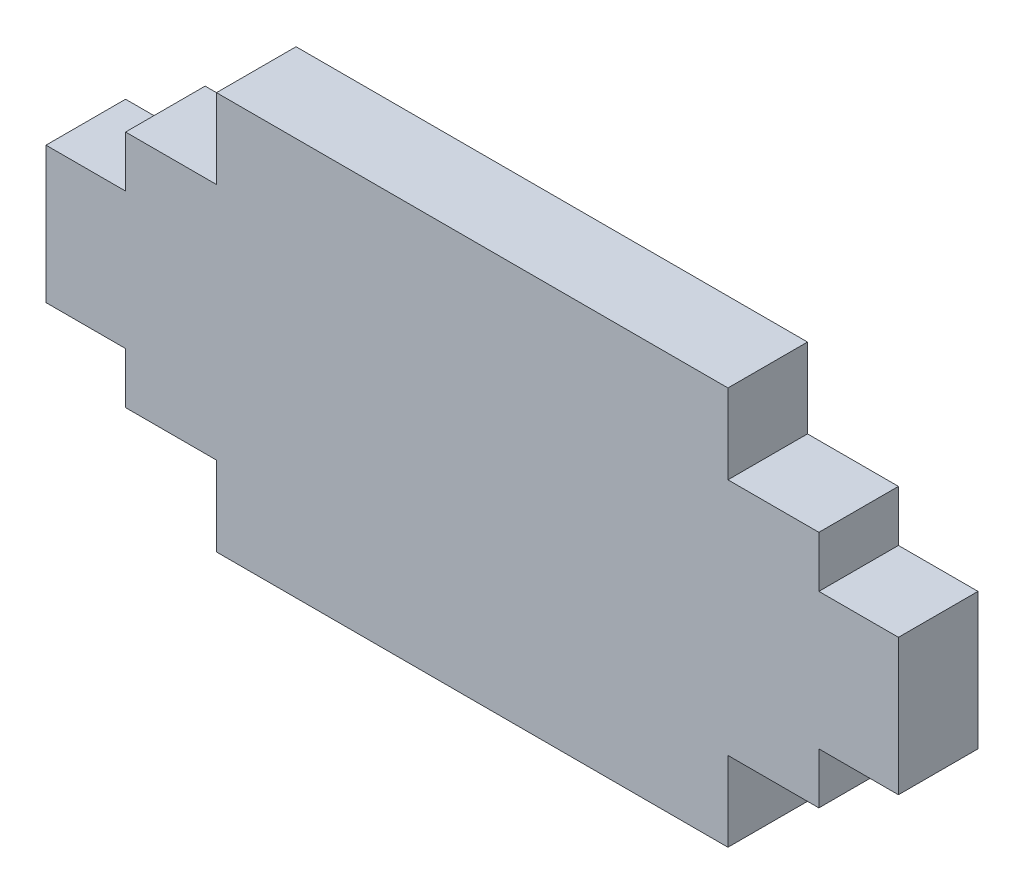
ISO-10303-21;
HEADER;
FILE_DESCRIPTION(('STEP AP214'),'2;1');
FILE_NAME('part.step','',(''),(''),'','','');
FILE_SCHEMA(('AUTOMOTIVE_DESIGN { 1 0 10303 214 1 1 1 1 }'));
ENDSEC;
DATA;
#1=APPLICATION_CONTEXT('core data for automotive mechanical design processes');
#2=APPLICATION_PROTOCOL_DEFINITION('international standard','automotive_design',2000,#1);
#3=PRODUCT_CONTEXT('',#1,'mechanical');
#4=PRODUCT('Part','Part','',(#3));
#5=PRODUCT_RELATED_PRODUCT_CATEGORY('part','',(#4));
#6=PRODUCT_DEFINITION_FORMATION('','',#4);
#7=PRODUCT_DEFINITION_CONTEXT('part definition',#1,'design');
#8=PRODUCT_DEFINITION('design','',#6,#7);
#9=PRODUCT_DEFINITION_SHAPE('','',#8);
#10=(LENGTH_UNIT() NAMED_UNIT(*) SI_UNIT(.MILLI.,.METRE.));
#11=(NAMED_UNIT(*) PLANE_ANGLE_UNIT() SI_UNIT($,.RADIAN.));
#12=(NAMED_UNIT(*) SI_UNIT($,.STERADIAN.) SOLID_ANGLE_UNIT());
#13=UNCERTAINTY_MEASURE_WITH_UNIT(LENGTH_MEASURE(1.E-05),#10,'distance_accuracy_value','');
#14=(GEOMETRIC_REPRESENTATION_CONTEXT(3) GLOBAL_UNCERTAINTY_ASSIGNED_CONTEXT((#13)) GLOBAL_UNIT_ASSIGNED_CONTEXT((#10,
#11,#12)) REPRESENTATION_CONTEXT('',''));
#15=CARTESIAN_POINT('',(0.,0.,0.));
#16=DIRECTION('',(0.,0.,1.));
#17=DIRECTION('',(1.,0.,0.));
#18=AXIS2_PLACEMENT_3D('',#15,#16,#17);
#19=CARTESIAN_POINT('',(0.,-3.,3.5));
#20=DIRECTION('',(1.,0.,0.));
#21=DIRECTION('',(0.,0.,-1.));
#22=AXIS2_PLACEMENT_3D('',#19,#20,#21);
#23=PLANE('',#22);
#24=DIRECTION('',(0.,-1.,0.));
#25=VECTOR('',#24,1.);
#26=CARTESIAN_POINT('',(0.,-3.,0.));
#27=LINE('',#26,#25);
#28=CARTESIAN_POINT('',(0.,-3.,0.));
#29=VERTEX_POINT('',#28);
#30=CARTESIAN_POINT('',(0.,-5.25,0.));
#31=VERTEX_POINT('',#30);
#32=EDGE_CURVE('E216',#29,#31,#27,.T.);
#33=ORIENTED_EDGE('',*,*,#32,.T.);
#34=DIRECTION('',(0.,0.,-1.));
#35=VECTOR('',#34,1.);
#36=CARTESIAN_POINT('',(0.,-5.25,3.5));
#37=LINE('',#36,#35);
#38=CARTESIAN_POINT('',(0.,-5.25,3.5));
#39=VERTEX_POINT('',#38);
#40=EDGE_CURVE('E11',#39,#31,#37,.T.);
#41=ORIENTED_EDGE('',*,*,#40,.F.);
#42=DIRECTION('',(0.,-1.,0.));
#43=VECTOR('',#42,1.);
#44=CARTESIAN_POINT('',(0.,-3.,3.5));
#45=LINE('',#44,#43);
#46=CARTESIAN_POINT('',(0.,-3.,3.5));
#47=VERTEX_POINT('',#46);
#48=EDGE_CURVE('E254',#47,#39,#45,.T.);
#49=ORIENTED_EDGE('',*,*,#48,.F.);
#50=DIRECTION('',(0.,0.,-1.));
#51=VECTOR('',#50,1.);
#52=CARTESIAN_POINT('',(0.,-3.,3.5));
#53=LINE('',#52,#51);
#54=EDGE_CURVE('E212',#47,#29,#53,.T.);
#55=ORIENTED_EDGE('',*,*,#54,.T.);
#56=EDGE_LOOP('',(#33,#41,#49,#55));
#57=FACE_BOUND('',#56,.T.);
#58=ADVANCED_FACE('F47',(#57),#23,.F.);
#59=CARTESIAN_POINT('',(0.,-5.25,3.5));
#60=DIRECTION('',(0.,1.,0.));
#61=DIRECTION('',(0.,0.,1.));
#62=AXIS2_PLACEMENT_3D('',#59,#60,#61);
#63=PLANE('',#62);
#64=DIRECTION('',(1.,0.,0.));
#65=VECTOR('',#64,1.);
#66=CARTESIAN_POINT('',(0.,-5.25,0.));
#67=LINE('',#66,#65);
#68=CARTESIAN_POINT('',(4.,-5.25,0.));
#69=VERTEX_POINT('',#68);
#70=EDGE_CURVE('E219',#31,#69,#67,.T.);
#71=ORIENTED_EDGE('',*,*,#70,.T.);
#72=DIRECTION('',(0.,0.,-1.));
#73=VECTOR('',#72,1.);
#74=CARTESIAN_POINT('',(4.,-5.25,3.5));
#75=LINE('',#74,#73);
#76=CARTESIAN_POINT('',(4.,-5.25,3.5));
#77=VERTEX_POINT('',#76);
#78=EDGE_CURVE('E56',#77,#69,#75,.T.);
#79=ORIENTED_EDGE('',*,*,#78,.F.);
#80=DIRECTION('',(1.,0.,0.));
#81=VECTOR('',#80,1.);
#82=CARTESIAN_POINT('',(0.,-5.25,3.5));
#83=LINE('',#82,#81);
#84=EDGE_CURVE('E143',#39,#77,#83,.T.);
#85=ORIENTED_EDGE('',*,*,#84,.F.);
#86=ORIENTED_EDGE('',*,*,#40,.T.);
#87=EDGE_LOOP('',(#71,#79,#85,#86));
#88=FACE_BOUND('',#87,.T.);
#89=ADVANCED_FACE('F372',(#88),#63,.F.);
#90=CARTESIAN_POINT('',(4.,-5.25,3.5));
#91=DIRECTION('',(1.,0.,0.));
#92=DIRECTION('',(0.,0.,-1.));
#93=AXIS2_PLACEMENT_3D('',#90,#91,#92);
#94=PLANE('',#93);
#95=DIRECTION('',(0.,-1.,0.));
#96=VECTOR('',#95,1.);
#97=CARTESIAN_POINT('',(4.,-5.25,0.));
#98=LINE('',#97,#96);
#99=CARTESIAN_POINT('',(4.,-8.75,0.));
#100=VERTEX_POINT('',#99);
#101=EDGE_CURVE('E221',#69,#100,#98,.T.);
#102=ORIENTED_EDGE('',*,*,#101,.T.);
#103=DIRECTION('',(0.,0.,-1.));
#104=VECTOR('',#103,1.);
#105=CARTESIAN_POINT('',(4.,-8.75,3.5));
#106=LINE('',#105,#104);
#107=CARTESIAN_POINT('',(4.,-8.75,3.5));
#108=VERTEX_POINT('',#107);
#109=EDGE_CURVE('E297',#108,#100,#106,.T.);
#110=ORIENTED_EDGE('',*,*,#109,.F.);
#111=DIRECTION('',(0.,-1.,0.));
#112=VECTOR('',#111,1.);
#113=CARTESIAN_POINT('',(4.,-5.25,3.5));
#114=LINE('',#113,#112);
#115=EDGE_CURVE('E305',#77,#108,#114,.T.);
#116=ORIENTED_EDGE('',*,*,#115,.F.);
#117=ORIENTED_EDGE('',*,*,#78,.T.);
#118=EDGE_LOOP('',(#102,#110,#116,#117));
#119=FACE_BOUND('',#118,.T.);
#120=ADVANCED_FACE('F303',(#119),#94,.F.);
#121=CARTESIAN_POINT('',(4.,-8.75,3.5));
#122=DIRECTION('',(0.,1.,0.));
#123=DIRECTION('',(0.,0.,1.));
#124=AXIS2_PLACEMENT_3D('',#121,#122,#123);
#125=PLANE('',#124);
#126=DIRECTION('',(1.,0.,0.));
#127=VECTOR('',#126,1.);
#128=CARTESIAN_POINT('',(4.,-8.75,0.));
#129=LINE('',#128,#127);
#130=CARTESIAN_POINT('',(26.5,-8.75,0.));
#131=VERTEX_POINT('',#130);
#132=EDGE_CURVE('E223',#100,#131,#129,.T.);
#133=ORIENTED_EDGE('',*,*,#132,.T.);
#134=DIRECTION('',(0.,0.,-1.));
#135=VECTOR('',#134,1.);
#136=CARTESIAN_POINT('',(26.5,-8.75,3.5));
#137=LINE('',#136,#135);
#138=CARTESIAN_POINT('',(26.5,-8.75,3.5));
#139=VERTEX_POINT('',#138);
#140=EDGE_CURVE('E294',#139,#131,#137,.T.);
#141=ORIENTED_EDGE('',*,*,#140,.F.);
#142=DIRECTION('',(1.,0.,0.));
#143=VECTOR('',#142,1.);
#144=CARTESIAN_POINT('',(4.,-8.75,3.5));
#145=LINE('',#144,#143);
#146=EDGE_CURVE('E323',#108,#139,#145,.T.);
#147=ORIENTED_EDGE('',*,*,#146,.F.);
#148=ORIENTED_EDGE('',*,*,#109,.T.);
#149=EDGE_LOOP('',(#133,#141,#147,#148));
#150=FACE_BOUND('',#149,.T.);
#151=ADVANCED_FACE('F314',(#150),#125,.F.);
#152=CARTESIAN_POINT('',(26.5,-8.75,3.5));
#153=DIRECTION('',(-1.,0.,0.));
#154=DIRECTION('',(0.,0.,1.));
#155=AXIS2_PLACEMENT_3D('',#152,#153,#154);
#156=PLANE('',#155);
#157=DIRECTION('',(0.,1.,0.));
#158=VECTOR('',#157,1.);
#159=CARTESIAN_POINT('',(26.5,-8.75,0.));
#160=LINE('',#159,#158);
#161=CARTESIAN_POINT('',(26.5,-5.25,0.));
#162=VERTEX_POINT('',#161);
#163=EDGE_CURVE('E225',#131,#162,#160,.T.);
#164=ORIENTED_EDGE('',*,*,#163,.T.);
#165=DIRECTION('',(0.,0.,-1.));
#166=VECTOR('',#165,1.);
#167=CARTESIAN_POINT('',(26.5,-5.25,3.5));
#168=LINE('',#167,#166);
#169=CARTESIAN_POINT('',(26.5,-5.25,3.5));
#170=VERTEX_POINT('',#169);
#171=EDGE_CURVE('E291',#170,#162,#168,.T.);
#172=ORIENTED_EDGE('',*,*,#171,.F.);
#173=DIRECTION('',(0.,1.,0.));
#174=VECTOR('',#173,1.);
#175=CARTESIAN_POINT('',(26.5,-8.75,3.5));
#176=LINE('',#175,#174);
#177=EDGE_CURVE('E320',#139,#170,#176,.T.);
#178=ORIENTED_EDGE('',*,*,#177,.F.);
#179=ORIENTED_EDGE('',*,*,#140,.T.);
#180=EDGE_LOOP('',(#164,#172,#178,#179));
#181=FACE_BOUND('',#180,.T.);
#182=ADVANCED_FACE('F318',(#181),#156,.F.);
#183=CARTESIAN_POINT('',(26.5,-5.25,3.5));
#184=DIRECTION('',(0.,1.,0.));
#185=DIRECTION('',(0.,0.,1.));
#186=AXIS2_PLACEMENT_3D('',#183,#184,#185);
#187=PLANE('',#186);
#188=DIRECTION('',(1.,0.,0.));
#189=VECTOR('',#188,1.);
#190=CARTESIAN_POINT('',(26.5,-5.25,0.));
#191=LINE('',#190,#189);
#192=CARTESIAN_POINT('',(30.5,-5.25,0.));
#193=VERTEX_POINT('',#192);
#194=EDGE_CURVE('E227',#162,#193,#191,.T.);
#195=ORIENTED_EDGE('',*,*,#194,.T.);
#196=DIRECTION('',(0.,0.,-1.));
#197=VECTOR('',#196,1.);
#198=CARTESIAN_POINT('',(30.5,-5.25,3.5));
#199=LINE('',#198,#197);
#200=CARTESIAN_POINT('',(30.5,-5.25,3.5));
#201=VERTEX_POINT('',#200);
#202=EDGE_CURVE('E288',#201,#193,#199,.T.);
#203=ORIENTED_EDGE('',*,*,#202,.F.);
#204=DIRECTION('',(1.,0.,0.));
#205=VECTOR('',#204,1.);
#206=CARTESIAN_POINT('',(26.5,-5.25,3.5));
#207=LINE('',#206,#205);
#208=EDGE_CURVE('E322',#170,#201,#207,.T.);
#209=ORIENTED_EDGE('',*,*,#208,.F.);
#210=ORIENTED_EDGE('',*,*,#171,.T.);
#211=EDGE_LOOP('',(#195,#203,#209,#210));
#212=FACE_BOUND('',#211,.T.);
#213=ADVANCED_FACE('F388',(#212),#187,.F.);
#214=CARTESIAN_POINT('',(30.5,-5.25,3.5));
#215=DIRECTION('',(-1.,0.,0.));
#216=DIRECTION('',(0.,0.,1.));
#217=AXIS2_PLACEMENT_3D('',#214,#215,#216);
#218=PLANE('',#217);
#219=DIRECTION('',(0.,1.,0.));
#220=VECTOR('',#219,1.);
#221=CARTESIAN_POINT('',(30.5,-5.25,0.));
#222=LINE('',#221,#220);
#223=CARTESIAN_POINT('',(30.5,-3.,0.));
#224=VERTEX_POINT('',#223);
#225=EDGE_CURVE('E229',#193,#224,#222,.T.);
#226=ORIENTED_EDGE('',*,*,#225,.T.);
#227=DIRECTION('',(0.,0.,-1.));
#228=VECTOR('',#227,1.);
#229=CARTESIAN_POINT('',(30.5,-3.,3.5));
#230=LINE('',#229,#228);
#231=CARTESIAN_POINT('',(30.5,-3.,3.5));
#232=VERTEX_POINT('',#231);
#233=EDGE_CURVE('E285',#232,#224,#230,.T.);
#234=ORIENTED_EDGE('',*,*,#233,.F.);
#235=DIRECTION('',(0.,1.,0.));
#236=VECTOR('',#235,1.);
#237=CARTESIAN_POINT('',(30.5,-5.25,3.5));
#238=LINE('',#237,#236);
#239=EDGE_CURVE('E325',#201,#232,#238,.T.);
#240=ORIENTED_EDGE('',*,*,#239,.F.);
#241=ORIENTED_EDGE('',*,*,#202,.T.);
#242=EDGE_LOOP('',(#226,#234,#240,#241));
#243=FACE_BOUND('',#242,.T.);
#244=ADVANCED_FACE('F392',(#243),#218,.F.);
#245=CARTESIAN_POINT('',(30.5,-3.,3.5));
#246=DIRECTION('',(0.,1.,0.));
#247=DIRECTION('',(0.,0.,1.));
#248=AXIS2_PLACEMENT_3D('',#245,#246,#247);
#249=PLANE('',#248);
#250=DIRECTION('',(1.,0.,0.));
#251=VECTOR('',#250,1.);
#252=CARTESIAN_POINT('',(30.5,-3.,0.));
#253=LINE('',#252,#251);
#254=CARTESIAN_POINT('',(34.,-3.,0.));
#255=VERTEX_POINT('',#254);
#256=EDGE_CURVE('E231',#224,#255,#253,.T.);
#257=ORIENTED_EDGE('',*,*,#256,.T.);
#258=DIRECTION('',(0.,0.,-1.));
#259=VECTOR('',#258,1.);
#260=CARTESIAN_POINT('',(34.,-3.,3.5));
#261=LINE('',#260,#259);
#262=CARTESIAN_POINT('',(34.,-3.,3.5));
#263=VERTEX_POINT('',#262);
#264=EDGE_CURVE('E282',#263,#255,#261,.T.);
#265=ORIENTED_EDGE('',*,*,#264,.F.);
#266=DIRECTION('',(1.,0.,0.));
#267=VECTOR('',#266,1.);
#268=CARTESIAN_POINT('',(30.5,-3.,3.5));
#269=LINE('',#268,#267);
#270=EDGE_CURVE('E331',#232,#263,#269,.T.);
#271=ORIENTED_EDGE('',*,*,#270,.F.);
#272=ORIENTED_EDGE('',*,*,#233,.T.);
#273=EDGE_LOOP('',(#257,#265,#271,#272));
#274=FACE_BOUND('',#273,.T.);
#275=ADVANCED_FACE('F397',(#274),#249,.F.);
#276=CARTESIAN_POINT('',(34.,-3.,3.5));
#277=DIRECTION('',(-1.,0.,0.));
#278=DIRECTION('',(0.,0.,1.));
#279=AXIS2_PLACEMENT_3D('',#276,#277,#278);
#280=PLANE('',#279);
#281=DIRECTION('',(0.,1.,0.));
#282=VECTOR('',#281,1.);
#283=CARTESIAN_POINT('',(34.,-3.,0.));
#284=LINE('',#283,#282);
#285=CARTESIAN_POINT('',(34.,3.,0.));
#286=VERTEX_POINT('',#285);
#287=EDGE_CURVE('E233',#255,#286,#284,.T.);
#288=ORIENTED_EDGE('',*,*,#287,.T.);
#289=DIRECTION('',(0.,0.,-1.));
#290=VECTOR('',#289,1.);
#291=CARTESIAN_POINT('',(34.,3.,3.5));
#292=LINE('',#291,#290);
#293=CARTESIAN_POINT('',(34.,3.,3.5));
#294=VERTEX_POINT('',#293);
#295=EDGE_CURVE('E279',#294,#286,#292,.T.);
#296=ORIENTED_EDGE('',*,*,#295,.F.);
#297=DIRECTION('',(0.,1.,0.));
#298=VECTOR('',#297,1.);
#299=CARTESIAN_POINT('',(34.,-3.,3.5));
#300=LINE('',#299,#298);
#301=EDGE_CURVE('E333',#263,#294,#300,.T.);
#302=ORIENTED_EDGE('',*,*,#301,.F.);
#303=ORIENTED_EDGE('',*,*,#264,.T.);
#304=EDGE_LOOP('',(#288,#296,#302,#303));
#305=FACE_BOUND('',#304,.T.);
#306=ADVANCED_FACE('F402',(#305),#280,.F.);
#307=CARTESIAN_POINT('',(34.,3.,3.5));
#308=DIRECTION('',(0.,-1.,0.));
#309=DIRECTION('',(0.,0.,-1.));
#310=AXIS2_PLACEMENT_3D('',#307,#308,#309);
#311=PLANE('',#310);
#312=DIRECTION('',(-1.,0.,0.));
#313=VECTOR('',#312,1.);
#314=CARTESIAN_POINT('',(34.,3.,0.));
#315=LINE('',#314,#313);
#316=CARTESIAN_POINT('',(30.5,3.,0.));
#317=VERTEX_POINT('',#316);
#318=EDGE_CURVE('E235',#286,#317,#315,.T.);
#319=ORIENTED_EDGE('',*,*,#318,.T.);
#320=DIRECTION('',(0.,0.,-1.));
#321=VECTOR('',#320,1.);
#322=CARTESIAN_POINT('',(30.5,3.,3.5));
#323=LINE('',#322,#321);
#324=CARTESIAN_POINT('',(30.5,3.,3.5));
#325=VERTEX_POINT('',#324);
#326=EDGE_CURVE('E276',#325,#317,#323,.T.);
#327=ORIENTED_EDGE('',*,*,#326,.F.);
#328=DIRECTION('',(-1.,0.,0.));
#329=VECTOR('',#328,1.);
#330=CARTESIAN_POINT('',(34.,3.,3.5));
#331=LINE('',#330,#329);
#332=EDGE_CURVE('E335',#294,#325,#331,.T.);
#333=ORIENTED_EDGE('',*,*,#332,.F.);
#334=ORIENTED_EDGE('',*,*,#295,.T.);
#335=EDGE_LOOP('',(#319,#327,#333,#334));
#336=FACE_BOUND('',#335,.T.);
#337=ADVANCED_FACE('F407',(#336),#311,.F.);
#338=CARTESIAN_POINT('',(30.5,3.,3.5));
#339=DIRECTION('',(-1.,0.,0.));
#340=DIRECTION('',(0.,0.,1.));
#341=AXIS2_PLACEMENT_3D('',#338,#339,#340);
#342=PLANE('',#341);
#343=DIRECTION('',(0.,1.,0.));
#344=VECTOR('',#343,1.);
#345=CARTESIAN_POINT('',(30.5,3.,0.));
#346=LINE('',#345,#344);
#347=CARTESIAN_POINT('',(30.5,5.25,0.));
#348=VERTEX_POINT('',#347);
#349=EDGE_CURVE('E237',#317,#348,#346,.T.);
#350=ORIENTED_EDGE('',*,*,#349,.T.);
#351=DIRECTION('',(0.,0.,-1.));
#352=VECTOR('',#351,1.);
#353=CARTESIAN_POINT('',(30.5,5.25,3.5));
#354=LINE('',#353,#352);
#355=CARTESIAN_POINT('',(30.5,5.25,3.5));
#356=VERTEX_POINT('',#355);
#357=EDGE_CURVE('E273',#356,#348,#354,.T.);
#358=ORIENTED_EDGE('',*,*,#357,.F.);
#359=DIRECTION('',(0.,1.,0.));
#360=VECTOR('',#359,1.);
#361=CARTESIAN_POINT('',(30.5,3.,3.5));
#362=LINE('',#361,#360);
#363=EDGE_CURVE('E337',#325,#356,#362,.T.);
#364=ORIENTED_EDGE('',*,*,#363,.F.);
#365=ORIENTED_EDGE('',*,*,#326,.T.);
#366=EDGE_LOOP('',(#350,#358,#364,#365));
#367=FACE_BOUND('',#366,.T.);
#368=ADVANCED_FACE('F412',(#367),#342,.F.);
#369=CARTESIAN_POINT('',(30.5,5.25,3.5));
#370=DIRECTION('',(0.,-1.,0.));
#371=DIRECTION('',(0.,0.,-1.));
#372=AXIS2_PLACEMENT_3D('',#369,#370,#371);
#373=PLANE('',#372);
#374=DIRECTION('',(-1.,0.,0.));
#375=VECTOR('',#374,1.);
#376=CARTESIAN_POINT('',(30.5,5.25,0.));
#377=LINE('',#376,#375);
#378=CARTESIAN_POINT('',(26.5,5.25,0.));
#379=VERTEX_POINT('',#378);
#380=EDGE_CURVE('E239',#348,#379,#377,.T.);
#381=ORIENTED_EDGE('',*,*,#380,.T.);
#382=DIRECTION('',(0.,0.,-1.));
#383=VECTOR('',#382,1.);
#384=CARTESIAN_POINT('',(26.5,5.25,3.5));
#385=LINE('',#384,#383);
#386=CARTESIAN_POINT('',(26.5,5.25,3.5));
#387=VERTEX_POINT('',#386);
#388=EDGE_CURVE('E270',#387,#379,#385,.T.);
#389=ORIENTED_EDGE('',*,*,#388,.F.);
#390=DIRECTION('',(-1.,0.,0.));
#391=VECTOR('',#390,1.);
#392=CARTESIAN_POINT('',(30.5,5.25,3.5));
#393=LINE('',#392,#391);
#394=EDGE_CURVE('E339',#356,#387,#393,.T.);
#395=ORIENTED_EDGE('',*,*,#394,.F.);
#396=ORIENTED_EDGE('',*,*,#357,.T.);
#397=EDGE_LOOP('',(#381,#389,#395,#396));
#398=FACE_BOUND('',#397,.T.);
#399=ADVANCED_FACE('F417',(#398),#373,.F.);
#400=CARTESIAN_POINT('',(26.5,5.25,3.5));
#401=DIRECTION('',(-1.,0.,0.));
#402=DIRECTION('',(0.,0.,1.));
#403=AXIS2_PLACEMENT_3D('',#400,#401,#402);
#404=PLANE('',#403);
#405=DIRECTION('',(0.,1.,0.));
#406=VECTOR('',#405,1.);
#407=CARTESIAN_POINT('',(26.5,5.25,0.));
#408=LINE('',#407,#406);
#409=CARTESIAN_POINT('',(26.5,8.75,0.));
#410=VERTEX_POINT('',#409);
#411=EDGE_CURVE('E241',#379,#410,#408,.T.);
#412=ORIENTED_EDGE('',*,*,#411,.T.);
#413=DIRECTION('',(0.,0.,-1.));
#414=VECTOR('',#413,1.);
#415=CARTESIAN_POINT('',(26.5,8.75,3.5));
#416=LINE('',#415,#414);
#417=CARTESIAN_POINT('',(26.5,8.75,3.5));
#418=VERTEX_POINT('',#417);
#419=EDGE_CURVE('E267',#418,#410,#416,.T.);
#420=ORIENTED_EDGE('',*,*,#419,.F.);
#421=DIRECTION('',(0.,1.,0.));
#422=VECTOR('',#421,1.);
#423=CARTESIAN_POINT('',(26.5,5.25,3.5));
#424=LINE('',#423,#422);
#425=EDGE_CURVE('E341',#387,#418,#424,.T.);
#426=ORIENTED_EDGE('',*,*,#425,.F.);
#427=ORIENTED_EDGE('',*,*,#388,.T.);
#428=EDGE_LOOP('',(#412,#420,#426,#427));
#429=FACE_BOUND('',#428,.T.);
#430=ADVANCED_FACE('F422',(#429),#404,.F.);
#431=CARTESIAN_POINT('',(26.5,8.75,3.5));
#432=DIRECTION('',(0.,-1.,0.));
#433=DIRECTION('',(0.,0.,-1.));
#434=AXIS2_PLACEMENT_3D('',#431,#432,#433);
#435=PLANE('',#434);
#436=DIRECTION('',(-1.,0.,0.));
#437=VECTOR('',#436,1.);
#438=CARTESIAN_POINT('',(26.5,8.75,0.));
#439=LINE('',#438,#437);
#440=CARTESIAN_POINT('',(4.,8.75,0.));
#441=VERTEX_POINT('',#440);
#442=EDGE_CURVE('E243',#410,#441,#439,.T.);
#443=ORIENTED_EDGE('',*,*,#442,.T.);
#444=DIRECTION('',(0.,0.,-1.));
#445=VECTOR('',#444,1.);
#446=CARTESIAN_POINT('',(4.,8.75,3.5));
#447=LINE('',#446,#445);
#448=CARTESIAN_POINT('',(4.,8.75,3.5));
#449=VERTEX_POINT('',#448);
#450=EDGE_CURVE('E264',#449,#441,#447,.T.);
#451=ORIENTED_EDGE('',*,*,#450,.F.);
#452=DIRECTION('',(-1.,0.,0.));
#453=VECTOR('',#452,1.);
#454=CARTESIAN_POINT('',(26.5,8.75,3.5));
#455=LINE('',#454,#453);
#456=EDGE_CURVE('E343',#418,#449,#455,.T.);
#457=ORIENTED_EDGE('',*,*,#456,.F.);
#458=ORIENTED_EDGE('',*,*,#419,.T.);
#459=EDGE_LOOP('',(#443,#451,#457,#458));
#460=FACE_BOUND('',#459,.T.);
#461=ADVANCED_FACE('F427',(#460),#435,.F.);
#462=CARTESIAN_POINT('',(4.,8.75,3.5));
#463=DIRECTION('',(1.,0.,0.));
#464=DIRECTION('',(0.,0.,-1.));
#465=AXIS2_PLACEMENT_3D('',#462,#463,#464);
#466=PLANE('',#465);
#467=DIRECTION('',(0.,-1.,0.));
#468=VECTOR('',#467,1.);
#469=CARTESIAN_POINT('',(4.,8.75,0.));
#470=LINE('',#469,#468);
#471=CARTESIAN_POINT('',(4.,5.25,0.));
#472=VERTEX_POINT('',#471);
#473=EDGE_CURVE('E245',#441,#472,#470,.T.);
#474=ORIENTED_EDGE('',*,*,#473,.T.);
#475=DIRECTION('',(0.,0.,-1.));
#476=VECTOR('',#475,1.);
#477=CARTESIAN_POINT('',(4.,5.25,3.5));
#478=LINE('',#477,#476);
#479=CARTESIAN_POINT('',(4.,5.25,3.5));
#480=VERTEX_POINT('',#479);
#481=EDGE_CURVE('E261',#480,#472,#478,.T.);
#482=ORIENTED_EDGE('',*,*,#481,.F.);
#483=DIRECTION('',(0.,-1.,0.));
#484=VECTOR('',#483,1.);
#485=CARTESIAN_POINT('',(4.,8.75,3.5));
#486=LINE('',#485,#484);
#487=EDGE_CURVE('E345',#449,#480,#486,.T.);
#488=ORIENTED_EDGE('',*,*,#487,.F.);
#489=ORIENTED_EDGE('',*,*,#450,.T.);
#490=EDGE_LOOP('',(#474,#482,#488,#489));
#491=FACE_BOUND('',#490,.T.);
#492=ADVANCED_FACE('F432',(#491),#466,.F.);
#493=CARTESIAN_POINT('',(4.,5.25,3.5));
#494=DIRECTION('',(0.,-1.,0.));
#495=DIRECTION('',(0.,0.,-1.));
#496=AXIS2_PLACEMENT_3D('',#493,#494,#495);
#497=PLANE('',#496);
#498=DIRECTION('',(-1.,0.,0.));
#499=VECTOR('',#498,1.);
#500=CARTESIAN_POINT('',(4.,5.25,0.));
#501=LINE('',#500,#499);
#502=CARTESIAN_POINT('',(0.,5.25,0.));
#503=VERTEX_POINT('',#502);
#504=EDGE_CURVE('E247',#472,#503,#501,.T.);
#505=ORIENTED_EDGE('',*,*,#504,.T.);
#506=DIRECTION('',(0.,0.,-1.));
#507=VECTOR('',#506,1.);
#508=CARTESIAN_POINT('',(0.,5.25,3.5));
#509=LINE('',#508,#507);
#510=CARTESIAN_POINT('',(0.,5.25,3.5));
#511=VERTEX_POINT('',#510);
#512=EDGE_CURVE('E258',#511,#503,#509,.T.);
#513=ORIENTED_EDGE('',*,*,#512,.F.);
#514=DIRECTION('',(-1.,0.,0.));
#515=VECTOR('',#514,1.);
#516=CARTESIAN_POINT('',(4.,5.25,3.5));
#517=LINE('',#516,#515);
#518=EDGE_CURVE('E347',#480,#511,#517,.T.);
#519=ORIENTED_EDGE('',*,*,#518,.F.);
#520=ORIENTED_EDGE('',*,*,#481,.T.);
#521=EDGE_LOOP('',(#505,#513,#519,#520));
#522=FACE_BOUND('',#521,.T.);
#523=ADVANCED_FACE('F353',(#522),#497,.F.);
#524=CARTESIAN_POINT('',(0.,5.25,3.5));
#525=DIRECTION('',(1.,0.,0.));
#526=DIRECTION('',(0.,0.,-1.));
#527=AXIS2_PLACEMENT_3D('',#524,#525,#526);
#528=PLANE('',#527);
#529=DIRECTION('',(0.,-1.,0.));
#530=VECTOR('',#529,1.);
#531=CARTESIAN_POINT('',(0.,5.25,0.));
#532=LINE('',#531,#530);
#533=CARTESIAN_POINT('',(0.,3.,0.));
#534=VERTEX_POINT('',#533);
#535=EDGE_CURVE('E249',#503,#534,#532,.T.);
#536=ORIENTED_EDGE('',*,*,#535,.T.);
#537=DIRECTION('',(0.,0.,-1.));
#538=VECTOR('',#537,1.);
#539=CARTESIAN_POINT('',(0.,3.,3.5));
#540=LINE('',#539,#538);
#541=CARTESIAN_POINT('',(0.,3.,3.5));
#542=VERTEX_POINT('',#541);
#543=EDGE_CURVE('E207',#542,#534,#540,.T.);
#544=ORIENTED_EDGE('',*,*,#543,.F.);
#545=DIRECTION('',(0.,-1.,0.));
#546=VECTOR('',#545,1.);
#547=CARTESIAN_POINT('',(0.,5.25,3.5));
#548=LINE('',#547,#546);
#549=EDGE_CURVE('E198',#511,#542,#548,.T.);
#550=ORIENTED_EDGE('',*,*,#549,.F.);
#551=ORIENTED_EDGE('',*,*,#512,.T.);
#552=EDGE_LOOP('',(#536,#544,#550,#551));
#553=FACE_BOUND('',#552,.T.);
#554=ADVANCED_FACE('F357',(#553),#528,.F.);
#555=CARTESIAN_POINT('',(0.,3.,3.5));
#556=DIRECTION('',(0.,-1.,0.));
#557=DIRECTION('',(0.,0.,-1.));
#558=AXIS2_PLACEMENT_3D('',#555,#556,#557);
#559=PLANE('',#558);
#560=DIRECTION('',(-1.,0.,0.));
#561=VECTOR('',#560,1.);
#562=CARTESIAN_POINT('',(0.,3.,0.));
#563=LINE('',#562,#561);
#564=CARTESIAN_POINT('',(-3.5,3.,0.));
#565=VERTEX_POINT('',#564);
#566=EDGE_CURVE('E206',#534,#565,#563,.T.);
#567=ORIENTED_EDGE('',*,*,#566,.T.);
#568=DIRECTION('',(0.,0.,-1.));
#569=VECTOR('',#568,1.);
#570=CARTESIAN_POINT('',(-3.5,3.,3.5));
#571=LINE('',#570,#569);
#572=CARTESIAN_POINT('',(-3.5,3.,3.5));
#573=VERTEX_POINT('',#572);
#574=EDGE_CURVE('E203',#573,#565,#571,.T.);
#575=ORIENTED_EDGE('',*,*,#574,.F.);
#576=DIRECTION('',(-1.,0.,0.));
#577=VECTOR('',#576,1.);
#578=CARTESIAN_POINT('',(0.,3.,3.5));
#579=LINE('',#578,#577);
#580=EDGE_CURVE('E192',#542,#573,#579,.T.);
#581=ORIENTED_EDGE('',*,*,#580,.F.);
#582=ORIENTED_EDGE('',*,*,#543,.T.);
#583=EDGE_LOOP('',(#567,#575,#581,#582));
#584=FACE_BOUND('',#583,.T.);
#585=ADVANCED_FACE('F204',(#584),#559,.F.);
#586=CARTESIAN_POINT('',(-3.5,3.,3.5));
#587=DIRECTION('',(1.,0.,0.));
#588=DIRECTION('',(0.,0.,-1.));
#589=AXIS2_PLACEMENT_3D('',#586,#587,#588);
#590=PLANE('',#589);
#591=DIRECTION('',(0.,-1.,0.));
#592=VECTOR('',#591,1.);
#593=CARTESIAN_POINT('',(-3.5,3.,0.));
#594=LINE('',#593,#592);
#595=CARTESIAN_POINT('',(-3.5,-3.,0.));
#596=VERTEX_POINT('',#595);
#597=EDGE_CURVE('E129',#565,#596,#594,.T.);
#598=ORIENTED_EDGE('',*,*,#597,.T.);
#599=DIRECTION('',(0.,0.,-1.));
#600=VECTOR('',#599,1.);
#601=CARTESIAN_POINT('',(-3.5,-3.,3.5));
#602=LINE('',#601,#600);
#603=CARTESIAN_POINT('',(-3.5,-3.,3.5));
#604=VERTEX_POINT('',#603);
#605=EDGE_CURVE('E208',#604,#596,#602,.T.);
#606=ORIENTED_EDGE('',*,*,#605,.F.);
#607=DIRECTION('',(0.,-1.,0.));
#608=VECTOR('',#607,1.);
#609=CARTESIAN_POINT('',(-3.5,3.,3.5));
#610=LINE('',#609,#608);
#611=EDGE_CURVE('E196',#573,#604,#610,.T.);
#612=ORIENTED_EDGE('',*,*,#611,.F.);
#613=ORIENTED_EDGE('',*,*,#574,.T.);
#614=EDGE_LOOP('',(#598,#606,#612,#613));
#615=FACE_BOUND('',#614,.T.);
#616=ADVANCED_FACE('F210',(#615),#590,.F.);
#617=CARTESIAN_POINT('',(-3.5,-3.,3.5));
#618=DIRECTION('',(0.,1.,0.));
#619=DIRECTION('',(0.,0.,1.));
#620=AXIS2_PLACEMENT_3D('',#617,#618,#619);
#621=PLANE('',#620);
#622=DIRECTION('',(1.,0.,0.));
#623=VECTOR('',#622,1.);
#624=CARTESIAN_POINT('',(-3.5,-3.,0.));
#625=LINE('',#624,#623);
#626=EDGE_CURVE('E135',#596,#29,#625,.T.);
#627=ORIENTED_EDGE('',*,*,#626,.T.);
#628=ORIENTED_EDGE('',*,*,#54,.F.);
#629=DIRECTION('',(1.,0.,0.));
#630=VECTOR('',#629,1.);
#631=CARTESIAN_POINT('',(-3.5,-3.,3.5));
#632=LINE('',#631,#630);
#633=EDGE_CURVE('E64',#604,#47,#632,.T.);
#634=ORIENTED_EDGE('',*,*,#633,.F.);
#635=ORIENTED_EDGE('',*,*,#605,.T.);
#636=EDGE_LOOP('',(#627,#628,#634,#635));
#637=FACE_BOUND('',#636,.T.);
#638=ADVANCED_FACE('F361',(#637),#621,.F.);
#639=CARTESIAN_POINT('',(0.,0.,3.5));
#640=DIRECTION('',(0.,0.,1.));
#641=DIRECTION('',(1.,0.,0.));
#642=AXIS2_PLACEMENT_3D('',#639,#640,#641);
#643=PLANE('',#642);
#644=ORIENTED_EDGE('',*,*,#48,.T.);
#645=ORIENTED_EDGE('',*,*,#84,.T.);
#646=ORIENTED_EDGE('',*,*,#115,.T.);
#647=ORIENTED_EDGE('',*,*,#146,.T.);
#648=ORIENTED_EDGE('',*,*,#177,.T.);
#649=ORIENTED_EDGE('',*,*,#208,.T.);
#650=ORIENTED_EDGE('',*,*,#239,.T.);
#651=ORIENTED_EDGE('',*,*,#270,.T.);
#652=ORIENTED_EDGE('',*,*,#301,.T.);
#653=ORIENTED_EDGE('',*,*,#332,.T.);
#654=ORIENTED_EDGE('',*,*,#363,.T.);
#655=ORIENTED_EDGE('',*,*,#394,.T.);
#656=ORIENTED_EDGE('',*,*,#425,.T.);
#657=ORIENTED_EDGE('',*,*,#456,.T.);
#658=ORIENTED_EDGE('',*,*,#487,.T.);
#659=ORIENTED_EDGE('',*,*,#518,.T.);
#660=ORIENTED_EDGE('',*,*,#549,.T.);
#661=ORIENTED_EDGE('',*,*,#580,.T.);
#662=ORIENTED_EDGE('',*,*,#611,.T.);
#663=ORIENTED_EDGE('',*,*,#633,.T.);
#664=EDGE_LOOP('',(#644,#645,#646,#647,#648,#649,#650,#651,#652,#653,#654,#655,#656,#657,#658,
#659,#660,#661,#662,#663));
#665=FACE_BOUND('',#664,.T.);
#666=ADVANCED_FACE('F194',(#665),#643,.T.);
#667=CARTESIAN_POINT('',(0.,0.,0.));
#668=DIRECTION('',(0.,0.,1.));
#669=DIRECTION('',(1.,0.,0.));
#670=AXIS2_PLACEMENT_3D('',#667,#668,#669);
#671=PLANE('',#670);
#672=ORIENTED_EDGE('',*,*,#32,.F.);
#673=ORIENTED_EDGE('',*,*,#626,.F.);
#674=ORIENTED_EDGE('',*,*,#597,.F.);
#675=ORIENTED_EDGE('',*,*,#566,.F.);
#676=ORIENTED_EDGE('',*,*,#535,.F.);
#677=ORIENTED_EDGE('',*,*,#504,.F.);
#678=ORIENTED_EDGE('',*,*,#473,.F.);
#679=ORIENTED_EDGE('',*,*,#442,.F.);
#680=ORIENTED_EDGE('',*,*,#411,.F.);
#681=ORIENTED_EDGE('',*,*,#380,.F.);
#682=ORIENTED_EDGE('',*,*,#349,.F.);
#683=ORIENTED_EDGE('',*,*,#318,.F.);
#684=ORIENTED_EDGE('',*,*,#287,.F.);
#685=ORIENTED_EDGE('',*,*,#256,.F.);
#686=ORIENTED_EDGE('',*,*,#225,.F.);
#687=ORIENTED_EDGE('',*,*,#194,.F.);
#688=ORIENTED_EDGE('',*,*,#163,.F.);
#689=ORIENTED_EDGE('',*,*,#132,.F.);
#690=ORIENTED_EDGE('',*,*,#101,.F.);
#691=ORIENTED_EDGE('',*,*,#70,.F.);
#692=EDGE_LOOP('',(#672,#673,#674,#675,#676,#677,#678,#679,#680,#681,#682,#683,#684,#685,#686,
#687,#688,#689,#690,#691));
#693=FACE_BOUND('',#692,.T.);
#694=ADVANCED_FACE('F309',(#693),#671,.F.);
#695=CLOSED_SHELL('',(#58,#89,#120,#151,#182,#213,#244,#275,#306,#337,#368,#399,#430,#461,#492,
#523,#554,#585,#616,#638,#666,#694));
#696=MANIFOLD_SOLID_BREP('B2',#695);
#697=ADVANCED_BREP_SHAPE_REPRESENTATION('',(#18,#696),#14);
#698=SHAPE_DEFINITION_REPRESENTATION(#9,#697);
ENDSEC;
END-ISO-10303-21;
